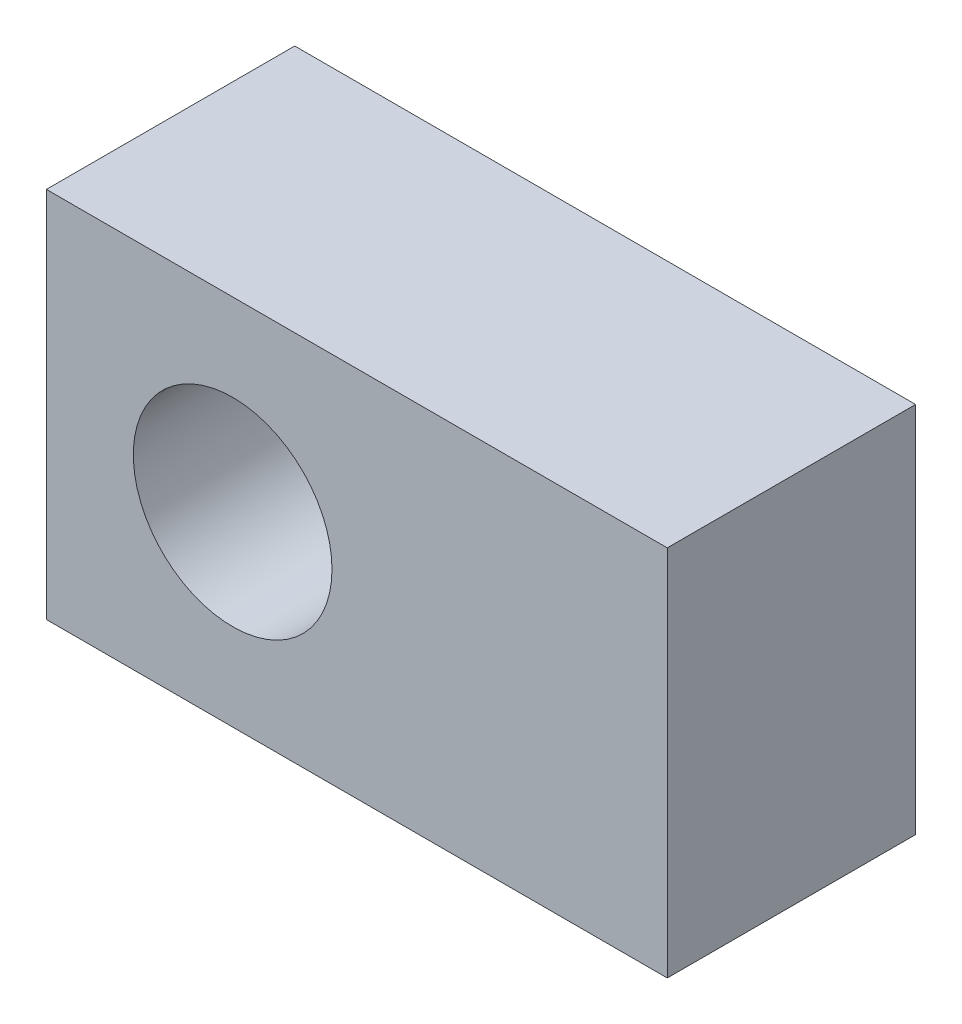
ISO-10303-21;
HEADER;
FILE_DESCRIPTION(('STEP AP214'),'2;1');
FILE_NAME('part.step','',(''),(''),'','','');
FILE_SCHEMA(('AUTOMOTIVE_DESIGN { 1 0 10303 214 1 1 1 1 }'));
ENDSEC;
DATA;
#1=APPLICATION_CONTEXT('core data for automotive mechanical design processes');
#2=APPLICATION_PROTOCOL_DEFINITION('international standard','automotive_design',2000,#1);
#3=PRODUCT_CONTEXT('',#1,'mechanical');
#4=PRODUCT('Part','Part','',(#3));
#5=PRODUCT_RELATED_PRODUCT_CATEGORY('part','',(#4));
#6=PRODUCT_DEFINITION_FORMATION('','',#4);
#7=PRODUCT_DEFINITION_CONTEXT('part definition',#1,'design');
#8=PRODUCT_DEFINITION('design','',#6,#7);
#9=PRODUCT_DEFINITION_SHAPE('','',#8);
#10=(LENGTH_UNIT() NAMED_UNIT(*) SI_UNIT(.MILLI.,.METRE.));
#11=(NAMED_UNIT(*) PLANE_ANGLE_UNIT() SI_UNIT($,.RADIAN.));
#12=(NAMED_UNIT(*) SI_UNIT($,.STERADIAN.) SOLID_ANGLE_UNIT());
#13=UNCERTAINTY_MEASURE_WITH_UNIT(LENGTH_MEASURE(1.E-05),#10,'distance_accuracy_value','');
#14=(GEOMETRIC_REPRESENTATION_CONTEXT(3) GLOBAL_UNCERTAINTY_ASSIGNED_CONTEXT((#13)) GLOBAL_UNIT_ASSIGNED_CONTEXT((#10,
#11,#12)) REPRESENTATION_CONTEXT('',''));
#15=CARTESIAN_POINT('',(0.,0.,0.));
#16=DIRECTION('',(0.,0.,1.));
#17=DIRECTION('',(1.,0.,0.));
#18=AXIS2_PLACEMENT_3D('',#15,#16,#17);
#19=CARTESIAN_POINT('',(0.,0.,10.));
#20=DIRECTION('',(0.,0.,-1.));
#21=DIRECTION('',(-1.,0.,0.));
#22=AXIS2_PLACEMENT_3D('',#19,#20,#21);
#23=PLANE('',#22);
#24=DIRECTION('',(0.,-1.,0.));
#25=VECTOR('',#24,1.);
#26=CARTESIAN_POINT('',(0.,0.,10.));
#27=LINE('',#26,#25);
#28=CARTESIAN_POINT('',(0.,15.,10.));
#29=VERTEX_POINT('',#28);
#30=CARTESIAN_POINT('',(0.,0.,10.));
#31=VERTEX_POINT('',#30);
#32=EDGE_CURVE('E92',#29,#31,#27,.T.);
#33=ORIENTED_EDGE('',*,*,#32,.T.);
#34=DIRECTION('',(1.,0.,0.));
#35=VECTOR('',#34,1.);
#36=CARTESIAN_POINT('',(0.,0.,10.));
#37=LINE('',#36,#35);
#38=CARTESIAN_POINT('',(25.,0.,10.));
#39=VERTEX_POINT('',#38);
#40=EDGE_CURVE('E87',#31,#39,#37,.T.);
#41=ORIENTED_EDGE('',*,*,#40,.T.);
#42=DIRECTION('',(0.,1.,0.));
#43=VECTOR('',#42,1.);
#44=CARTESIAN_POINT('',(25.,0.,10.));
#45=LINE('',#44,#43);
#46=CARTESIAN_POINT('',(25.,15.,10.));
#47=VERTEX_POINT('',#46);
#48=EDGE_CURVE('E90',#39,#47,#45,.T.);
#49=ORIENTED_EDGE('',*,*,#48,.T.);
#50=DIRECTION('',(-1.,0.,0.));
#51=VECTOR('',#50,1.);
#52=CARTESIAN_POINT('',(0.,15.,10.));
#53=LINE('',#52,#51);
#54=EDGE_CURVE('E57',#47,#29,#53,.T.);
#55=ORIENTED_EDGE('',*,*,#54,.T.);
#56=EDGE_LOOP('',(#33,#41,#49,#55));
#57=FACE_BOUND('',#56,.T.);
#58=CARTESIAN_POINT('',(7.5,7.5,10.));
#59=DIRECTION('',(0.,0.,1.));
#60=DIRECTION('',(1.,0.,0.));
#61=AXIS2_PLACEMENT_3D('',#58,#59,#60);
#62=CIRCLE('',#61,4.);
#63=CARTESIAN_POINT('',(11.5,7.5,10.));
#64=VERTEX_POINT('',#63);
#65=EDGE_CURVE('E112',#64,#64,#62,.T.);
#66=ORIENTED_EDGE('',*,*,#65,.F.);
#67=EDGE_LOOP('',(#66));
#68=FACE_BOUND('',#67,.T.);
#69=ADVANCED_FACE('F39',(#57,#68),#23,.F.);
#70=CARTESIAN_POINT('',(0.,0.,0.));
#71=DIRECTION('',(0.,0.,-1.));
#72=DIRECTION('',(-1.,0.,0.));
#73=AXIS2_PLACEMENT_3D('',#70,#71,#72);
#74=PLANE('',#73);
#75=DIRECTION('',(0.,-1.,0.));
#76=VECTOR('',#75,1.);
#77=CARTESIAN_POINT('',(0.,0.,0.));
#78=LINE('',#77,#76);
#79=CARTESIAN_POINT('',(0.,15.,0.));
#80=VERTEX_POINT('',#79);
#81=CARTESIAN_POINT('',(0.,0.,0.));
#82=VERTEX_POINT('',#81);
#83=EDGE_CURVE('E108',#80,#82,#78,.T.);
#84=ORIENTED_EDGE('',*,*,#83,.F.);
#85=DIRECTION('',(-1.,0.,0.));
#86=VECTOR('',#85,1.);
#87=CARTESIAN_POINT('',(0.,15.,0.));
#88=LINE('',#87,#86);
#89=CARTESIAN_POINT('',(25.,15.,0.));
#90=VERTEX_POINT('',#89);
#91=EDGE_CURVE('E80',#90,#80,#88,.T.);
#92=ORIENTED_EDGE('',*,*,#91,.F.);
#93=DIRECTION('',(0.,1.,0.));
#94=VECTOR('',#93,1.);
#95=CARTESIAN_POINT('',(25.,0.,0.));
#96=LINE('',#95,#94);
#97=CARTESIAN_POINT('',(25.,0.,0.));
#98=VERTEX_POINT('',#97);
#99=EDGE_CURVE('E74',#98,#90,#96,.T.);
#100=ORIENTED_EDGE('',*,*,#99,.F.);
#101=DIRECTION('',(1.,0.,0.));
#102=VECTOR('',#101,1.);
#103=CARTESIAN_POINT('',(0.,0.,0.));
#104=LINE('',#103,#102);
#105=EDGE_CURVE('E97',#82,#98,#104,.T.);
#106=ORIENTED_EDGE('',*,*,#105,.F.);
#107=EDGE_LOOP('',(#84,#92,#100,#106));
#108=FACE_BOUND('',#107,.T.);
#109=CARTESIAN_POINT('',(7.5,7.5,0.));
#110=DIRECTION('',(0.,0.,1.));
#111=DIRECTION('',(1.,0.,0.));
#112=AXIS2_PLACEMENT_3D('',#109,#110,#111);
#113=CIRCLE('',#112,4.);
#114=CARTESIAN_POINT('',(11.5,7.5,0.));
#115=VERTEX_POINT('',#114);
#116=EDGE_CURVE('E130',#115,#115,#113,.T.);
#117=ORIENTED_EDGE('',*,*,#116,.T.);
#118=EDGE_LOOP('',(#117));
#119=FACE_BOUND('',#118,.T.);
#120=ADVANCED_FACE('F125',(#108,#119),#74,.T.);
#121=CARTESIAN_POINT('',(0.,0.,10.));
#122=DIRECTION('',(1.,0.,0.));
#123=DIRECTION('',(0.,0.,-1.));
#124=AXIS2_PLACEMENT_3D('',#121,#122,#123);
#125=PLANE('',#124);
#126=ORIENTED_EDGE('',*,*,#83,.T.);
#127=DIRECTION('',(0.,0.,-1.));
#128=VECTOR('',#127,1.);
#129=CARTESIAN_POINT('',(0.,0.,10.));
#130=LINE('',#129,#128);
#131=EDGE_CURVE('E11',#31,#82,#130,.T.);
#132=ORIENTED_EDGE('',*,*,#131,.F.);
#133=ORIENTED_EDGE('',*,*,#32,.F.);
#134=DIRECTION('',(0.,0.,-1.));
#135=VECTOR('',#134,1.);
#136=CARTESIAN_POINT('',(0.,15.,10.));
#137=LINE('',#136,#135);
#138=EDGE_CURVE('E104',#29,#80,#137,.T.);
#139=ORIENTED_EDGE('',*,*,#138,.T.);
#140=EDGE_LOOP('',(#126,#132,#133,#139));
#141=FACE_BOUND('',#140,.T.);
#142=ADVANCED_FACE('F41',(#141),#125,.F.);
#143=CARTESIAN_POINT('',(0.,0.,10.));
#144=DIRECTION('',(0.,1.,0.));
#145=DIRECTION('',(0.,0.,1.));
#146=AXIS2_PLACEMENT_3D('',#143,#144,#145);
#147=PLANE('',#146);
#148=ORIENTED_EDGE('',*,*,#105,.T.);
#149=DIRECTION('',(0.,0.,-1.));
#150=VECTOR('',#149,1.);
#151=CARTESIAN_POINT('',(25.,0.,10.));
#152=LINE('',#151,#150);
#153=EDGE_CURVE('E49',#39,#98,#152,.T.);
#154=ORIENTED_EDGE('',*,*,#153,.F.);
#155=ORIENTED_EDGE('',*,*,#40,.F.);
#156=ORIENTED_EDGE('',*,*,#131,.T.);
#157=EDGE_LOOP('',(#148,#154,#155,#156));
#158=FACE_BOUND('',#157,.T.);
#159=ADVANCED_FACE('F96',(#158),#147,.F.);
#160=CARTESIAN_POINT('',(25.,0.,10.));
#161=DIRECTION('',(-1.,0.,0.));
#162=DIRECTION('',(0.,0.,1.));
#163=AXIS2_PLACEMENT_3D('',#160,#161,#162);
#164=PLANE('',#163);
#165=ORIENTED_EDGE('',*,*,#99,.T.);
#166=DIRECTION('',(0.,0.,-1.));
#167=VECTOR('',#166,1.);
#168=CARTESIAN_POINT('',(25.,15.,10.));
#169=LINE('',#168,#167);
#170=EDGE_CURVE('E99',#47,#90,#169,.T.);
#171=ORIENTED_EDGE('',*,*,#170,.F.);
#172=ORIENTED_EDGE('',*,*,#48,.F.);
#173=ORIENTED_EDGE('',*,*,#153,.T.);
#174=EDGE_LOOP('',(#165,#171,#172,#173));
#175=FACE_BOUND('',#174,.T.);
#176=ADVANCED_FACE('F100',(#175),#164,.F.);
#177=CARTESIAN_POINT('',(0.,15.,10.));
#178=DIRECTION('',(0.,-1.,0.));
#179=DIRECTION('',(0.,0.,-1.));
#180=AXIS2_PLACEMENT_3D('',#177,#178,#179);
#181=PLANE('',#180);
#182=ORIENTED_EDGE('',*,*,#91,.T.);
#183=ORIENTED_EDGE('',*,*,#138,.F.);
#184=ORIENTED_EDGE('',*,*,#54,.F.);
#185=ORIENTED_EDGE('',*,*,#170,.T.);
#186=EDGE_LOOP('',(#182,#183,#184,#185));
#187=FACE_BOUND('',#186,.T.);
#188=ADVANCED_FACE('F122',(#187),#181,.F.);
#189=CARTESIAN_POINT('',(7.5,7.5,10.));
#190=DIRECTION('',(0.,0.,-1.));
#191=DIRECTION('',(-1.,0.,0.));
#192=AXIS2_PLACEMENT_3D('',#189,#190,#191);
#193=CYLINDRICAL_SURFACE('',#192,4.);
#194=ORIENTED_EDGE('',*,*,#65,.T.);
#195=EDGE_LOOP('',(#194));
#196=FACE_BOUND('',#195,.T.);
#197=ORIENTED_EDGE('',*,*,#116,.F.);
#198=EDGE_LOOP('',(#197));
#199=FACE_BOUND('',#198,.T.);
#200=ADVANCED_FACE('F138',(#196,#199),#193,.F.);
#201=CLOSED_SHELL('',(#69,#120,#142,#159,#176,#188,#200));
#202=MANIFOLD_SOLID_BREP('B2',#201);
#203=ADVANCED_BREP_SHAPE_REPRESENTATION('',(#18,#202),#14);
#204=SHAPE_DEFINITION_REPRESENTATION(#9,#203);
ENDSEC;
END-ISO-10303-21;
